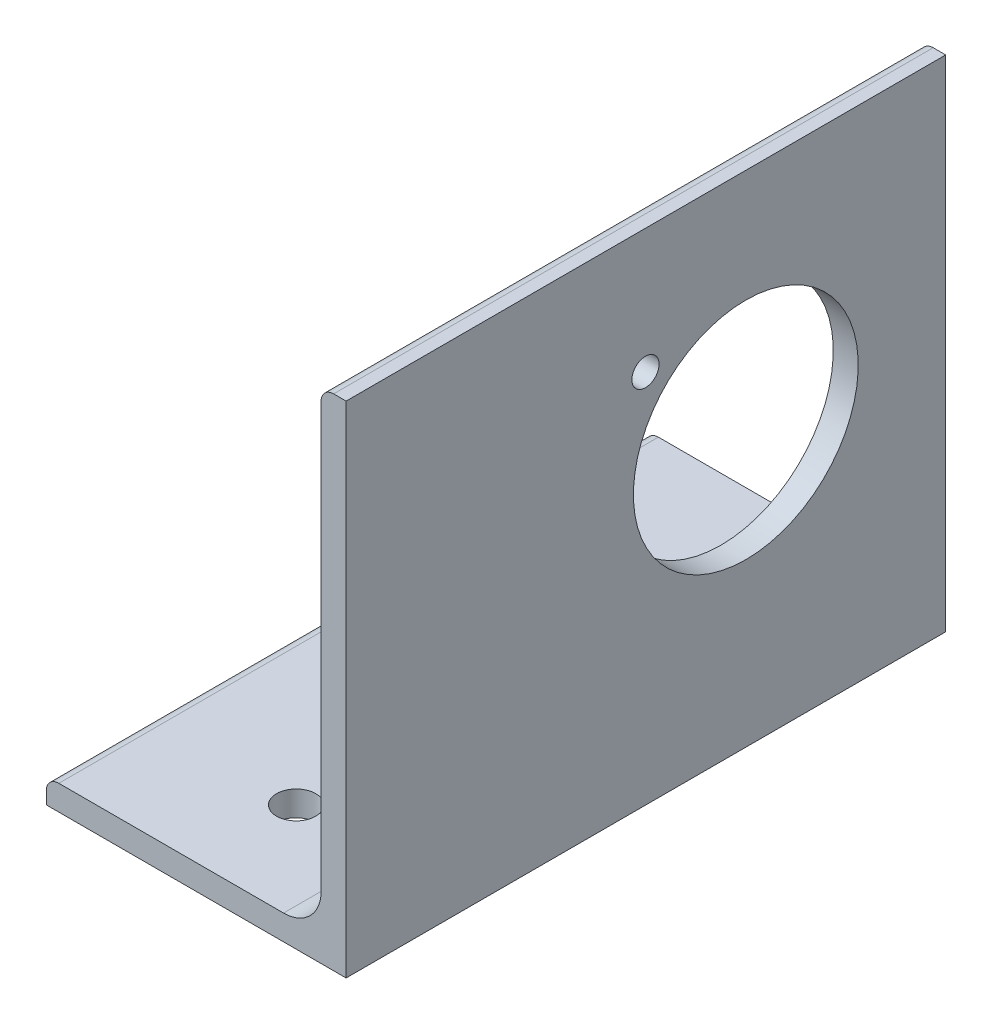
ISO-10303-21;
HEADER;
FILE_DESCRIPTION(('STEP AP214'),'2;1');
FILE_NAME('part.step','',(''),(''),'','','');
FILE_SCHEMA(('AUTOMOTIVE_DESIGN { 1 0 10303 214 1 1 1 1 }'));
ENDSEC;
DATA;
#1=APPLICATION_CONTEXT('core data for automotive mechanical design processes');
#2=APPLICATION_PROTOCOL_DEFINITION('international standard','automotive_design',2000,#1);
#3=PRODUCT_CONTEXT('',#1,'mechanical');
#4=PRODUCT('Part','Part','',(#3));
#5=PRODUCT_RELATED_PRODUCT_CATEGORY('part','',(#4));
#6=PRODUCT_DEFINITION_FORMATION('','',#4);
#7=PRODUCT_DEFINITION_CONTEXT('part definition',#1,'design');
#8=PRODUCT_DEFINITION('design','',#6,#7);
#9=PRODUCT_DEFINITION_SHAPE('','',#8);
#10=(LENGTH_UNIT() NAMED_UNIT(*) SI_UNIT(.MILLI.,.METRE.));
#11=(NAMED_UNIT(*) PLANE_ANGLE_UNIT() SI_UNIT($,.RADIAN.));
#12=(NAMED_UNIT(*) SI_UNIT($,.STERADIAN.) SOLID_ANGLE_UNIT());
#13=UNCERTAINTY_MEASURE_WITH_UNIT(LENGTH_MEASURE(1.E-05),#10,'distance_accuracy_value','');
#14=(GEOMETRIC_REPRESENTATION_CONTEXT(3) GLOBAL_UNCERTAINTY_ASSIGNED_CONTEXT((#13)) GLOBAL_UNIT_ASSIGNED_CONTEXT((#10,
#11,#12)) REPRESENTATION_CONTEXT('',''));
#15=CARTESIAN_POINT('',(0.,0.,0.));
#16=DIRECTION('',(0.,0.,1.));
#17=DIRECTION('',(1.,0.,0.));
#18=AXIS2_PLACEMENT_3D('',#15,#16,#17);
#19=CARTESIAN_POINT('',(-19.05,-30.1625,38.1));
#20=DIRECTION('',(1.,0.,0.));
#21=DIRECTION('',(0.,0.,-1.));
#22=AXIS2_PLACEMENT_3D('',#19,#20,#21);
#23=PLANE('',#22);
#24=DIRECTION('',(0.,-1.,0.));
#25=VECTOR('',#24,1.);
#26=CARTESIAN_POINT('',(-19.05,-30.1625,-38.1));
#27=LINE('',#26,#25);
#28=CARTESIAN_POINT('',(-19.05,-30.1625,-38.1));
#29=VERTEX_POINT('',#28);
#30=CARTESIAN_POINT('',(-19.05,-31.75,-38.1));
#31=VERTEX_POINT('',#30);
#32=EDGE_CURVE('E153',#29,#31,#27,.T.);
#33=ORIENTED_EDGE('',*,*,#32,.T.);
#34=DIRECTION('',(0.,0.,-1.));
#35=VECTOR('',#34,1.);
#36=CARTESIAN_POINT('',(-19.05,-31.75,38.1));
#37=LINE('',#36,#35);
#38=CARTESIAN_POINT('',(-19.05,-31.75,38.1));
#39=VERTEX_POINT('',#38);
#40=EDGE_CURVE('E11',#39,#31,#37,.T.);
#41=ORIENTED_EDGE('',*,*,#40,.F.);
#42=DIRECTION('',(0.,-1.,0.));
#43=VECTOR('',#42,1.);
#44=CARTESIAN_POINT('',(-19.05,-30.1625,38.1));
#45=LINE('',#44,#43);
#46=CARTESIAN_POINT('',(-19.05,-30.1625,38.1));
#47=VERTEX_POINT('',#46);
#48=EDGE_CURVE('E179',#47,#39,#45,.T.);
#49=ORIENTED_EDGE('',*,*,#48,.F.);
#50=DIRECTION('',(0.,0.,-1.));
#51=VECTOR('',#50,1.);
#52=CARTESIAN_POINT('',(-19.05,-30.1625,38.1));
#53=LINE('',#52,#51);
#54=EDGE_CURVE('E149',#47,#29,#53,.T.);
#55=ORIENTED_EDGE('',*,*,#54,.T.);
#56=EDGE_LOOP('',(#33,#41,#49,#55));
#57=FACE_BOUND('',#56,.T.);
#58=ADVANCED_FACE('F44',(#57),#23,.F.);
#59=CARTESIAN_POINT('',(-19.05,-31.75,38.1));
#60=DIRECTION('',(0.,1.,0.));
#61=DIRECTION('',(-1.,0.,0.));
#62=AXIS2_PLACEMENT_3D('',#59,#60,#61);
#63=PLANE('',#62);
#64=CARTESIAN_POINT('',(0.,-31.75,25.4));
#65=DIRECTION('',(0.,-1.,0.));
#66=DIRECTION('',(1.,0.,0.));
#67=AXIS2_PLACEMENT_3D('',#64,#65,#66);
#68=CIRCLE('',#67,2.4892);
#69=CARTESIAN_POINT('',(2.4892,-31.75,25.4));
#70=VERTEX_POINT('',#69);
#71=EDGE_CURVE('E203',#70,#70,#68,.T.);
#72=ORIENTED_EDGE('',*,*,#71,.F.);
#73=EDGE_LOOP('',(#72));
#74=FACE_BOUND('',#73,.T.);
#75=CARTESIAN_POINT('',(0.,-31.75,0.));
#76=DIRECTION('',(0.,-1.,0.));
#77=DIRECTION('',(1.,0.,0.));
#78=AXIS2_PLACEMENT_3D('',#75,#76,#77);
#79=CIRCLE('',#78,2.4892);
#80=CARTESIAN_POINT('',(2.4892,-31.75,0.));
#81=VERTEX_POINT('',#80);
#82=EDGE_CURVE('E211',#81,#81,#79,.T.);
#83=ORIENTED_EDGE('',*,*,#82,.F.);
#84=EDGE_LOOP('',(#83));
#85=FACE_BOUND('',#84,.T.);
#86=DIRECTION('',(1.,0.,0.));
#87=VECTOR('',#86,1.);
#88=CARTESIAN_POINT('',(-19.05,-31.75,-38.1));
#89=LINE('',#88,#87);
#90=CARTESIAN_POINT('',(19.05,-31.75,-38.1));
#91=VERTEX_POINT('',#90);
#92=EDGE_CURVE('E157',#31,#91,#89,.T.);
#93=ORIENTED_EDGE('',*,*,#92,.T.);
#94=DIRECTION('',(0.,0.,-1.));
#95=VECTOR('',#94,1.);
#96=CARTESIAN_POINT('',(19.05,-31.75,38.1));
#97=LINE('',#96,#95);
#98=CARTESIAN_POINT('',(19.05,-31.75,38.1));
#99=VERTEX_POINT('',#98);
#100=EDGE_CURVE('E54',#99,#91,#97,.T.);
#101=ORIENTED_EDGE('',*,*,#100,.F.);
#102=DIRECTION('',(1.,0.,0.));
#103=VECTOR('',#102,1.);
#104=CARTESIAN_POINT('',(-19.05,-31.75,38.1));
#105=LINE('',#104,#103);
#106=EDGE_CURVE('E109',#39,#99,#105,.T.);
#107=ORIENTED_EDGE('',*,*,#106,.F.);
#108=ORIENTED_EDGE('',*,*,#40,.T.);
#109=EDGE_LOOP('',(#93,#101,#107,#108));
#110=FACE_BOUND('',#109,.T.);
#111=ADVANCED_FACE('F275',(#74,#85,#110),#63,.F.);
#112=CARTESIAN_POINT('',(19.05,-31.75,38.1));
#113=DIRECTION('',(-1.,0.,0.));
#114=DIRECTION('',(0.,-1.,0.));
#115=AXIS2_PLACEMENT_3D('',#112,#113,#114);
#116=PLANE('',#115);
#117=CARTESIAN_POINT('',(19.05,15.9301386919437,0.0519634934806994));
#118=DIRECTION('',(-1.,0.,0.));
#119=DIRECTION('',(0.,-1.,0.));
#120=AXIS2_PLACEMENT_3D('',#117,#118,#119);
#121=CIRCLE('',#120,1.7272);
#122=CARTESIAN_POINT('',(19.05,14.2029386919437,0.0519634934806994));
#123=VERTEX_POINT('',#122);
#124=EDGE_CURVE('E209',#123,#123,#121,.T.);
#125=ORIENTED_EDGE('',*,*,#124,.T.);
#126=EDGE_LOOP('',(#125));
#127=FACE_BOUND('',#126,.T.);
#128=CARTESIAN_POINT('',(19.05,3.17817500002554,-12.7000001984375));
#129=DIRECTION('',(-1.,0.,0.));
#130=DIRECTION('',(0.,-1.,0.));
#131=AXIS2_PLACEMENT_3D('',#128,#129,#130);
#132=CIRCLE('',#131,14.2875);
#133=CARTESIAN_POINT('',(19.05,-11.1093249999745,-12.7000001984375));
#134=VERTEX_POINT('',#133);
#135=EDGE_CURVE('E158',#134,#134,#132,.T.);
#136=ORIENTED_EDGE('',*,*,#135,.T.);
#137=EDGE_LOOP('',(#136));
#138=FACE_BOUND('',#137,.T.);
#139=DIRECTION('',(0.,1.,0.));
#140=VECTOR('',#139,1.);
#141=CARTESIAN_POINT('',(19.05,-31.75,-38.1));
#142=LINE('',#141,#140);
#143=CARTESIAN_POINT('',(19.05,31.75,-38.1));
#144=VERTEX_POINT('',#143);
#145=EDGE_CURVE('E161',#91,#144,#142,.T.);
#146=ORIENTED_EDGE('',*,*,#145,.T.);
#147=DIRECTION('',(0.,0.,-1.));
#148=VECTOR('',#147,1.);
#149=CARTESIAN_POINT('',(19.05,31.75,38.1));
#150=LINE('',#149,#148);
#151=CARTESIAN_POINT('',(19.05,31.75,38.1));
#152=VERTEX_POINT('',#151);
#153=EDGE_CURVE('E194',#152,#144,#150,.T.);
#154=ORIENTED_EDGE('',*,*,#153,.F.);
#155=DIRECTION('',(0.,1.,0.));
#156=VECTOR('',#155,1.);
#157=CARTESIAN_POINT('',(19.05,-31.75,38.1));
#158=LINE('',#157,#156);
#159=EDGE_CURVE('E237',#99,#152,#158,.T.);
#160=ORIENTED_EDGE('',*,*,#159,.F.);
#161=ORIENTED_EDGE('',*,*,#100,.T.);
#162=EDGE_LOOP('',(#146,#154,#160,#161));
#163=FACE_BOUND('',#162,.T.);
#164=ADVANCED_FACE('F279',(#127,#138,#163),#116,.F.);
#165=CARTESIAN_POINT('',(17.4625,31.75,38.1));
#166=DIRECTION('',(0.,-1.,0.));
#167=DIRECTION('',(1.,0.,0.));
#168=AXIS2_PLACEMENT_3D('',#165,#166,#167);
#169=PLANE('',#168);
#170=DIRECTION('',(-1.,0.,0.));
#171=VECTOR('',#170,1.);
#172=CARTESIAN_POINT('',(17.4625,31.75,-38.1));
#173=LINE('',#172,#171);
#174=CARTESIAN_POINT('',(17.4625,31.75,-38.1));
#175=VERTEX_POINT('',#174);
#176=EDGE_CURVE('E164',#144,#175,#173,.T.);
#177=ORIENTED_EDGE('',*,*,#176,.T.);
#178=DIRECTION('',(0.,0.,-1.));
#179=VECTOR('',#178,1.);
#180=CARTESIAN_POINT('',(17.4625,31.75,38.1));
#181=LINE('',#180,#179);
#182=CARTESIAN_POINT('',(17.4625,31.75,38.1));
#183=VERTEX_POINT('',#182);
#184=EDGE_CURVE('E190',#183,#175,#181,.T.);
#185=ORIENTED_EDGE('',*,*,#184,.F.);
#186=DIRECTION('',(-1.,0.,0.));
#187=VECTOR('',#186,1.);
#188=CARTESIAN_POINT('',(17.4625,31.75,38.1));
#189=LINE('',#188,#187);
#190=EDGE_CURVE('E240',#152,#183,#189,.T.);
#191=ORIENTED_EDGE('',*,*,#190,.F.);
#192=ORIENTED_EDGE('',*,*,#153,.T.);
#193=EDGE_LOOP('',(#177,#185,#191,#192));
#194=FACE_BOUND('',#193,.T.);
#195=ADVANCED_FACE('F284',(#194),#169,.F.);
#196=CARTESIAN_POINT('',(17.4625,30.1625,38.1));
#197=DIRECTION('',(0.,0.,-1.));
#198=DIRECTION('',(-1.,0.,0.));
#199=AXIS2_PLACEMENT_3D('',#196,#197,#198);
#200=CYLINDRICAL_SURFACE('',#199,1.5875);
#201=CARTESIAN_POINT('',(17.4625,30.1625,-38.1));
#202=DIRECTION('',(0.,0.,1.));
#203=DIRECTION('',(-1.,0.,0.));
#204=AXIS2_PLACEMENT_3D('',#201,#202,#203);
#205=CIRCLE('',#204,1.5875);
#206=CARTESIAN_POINT('',(15.875,30.1625,-38.1));
#207=VERTEX_POINT('',#206);
#208=EDGE_CURVE('E167',#175,#207,#205,.T.);
#209=ORIENTED_EDGE('',*,*,#208,.T.);
#210=DIRECTION('',(0.,0.,-1.));
#211=VECTOR('',#210,1.);
#212=CARTESIAN_POINT('',(15.875,30.1625,38.1));
#213=LINE('',#212,#211);
#214=CARTESIAN_POINT('',(15.875,30.1625,38.1));
#215=VERTEX_POINT('',#214);
#216=EDGE_CURVE('E186',#215,#207,#213,.T.);
#217=ORIENTED_EDGE('',*,*,#216,.F.);
#218=CARTESIAN_POINT('',(17.4625,30.1625,38.1));
#219=DIRECTION('',(0.,0.,1.));
#220=DIRECTION('',(-1.,0.,0.));
#221=AXIS2_PLACEMENT_3D('',#218,#219,#220);
#222=CIRCLE('',#221,1.5875);
#223=EDGE_CURVE('E243',#183,#215,#222,.T.);
#224=ORIENTED_EDGE('',*,*,#223,.F.);
#225=ORIENTED_EDGE('',*,*,#184,.T.);
#226=EDGE_LOOP('',(#209,#217,#224,#225));
#227=FACE_BOUND('',#226,.T.);
#228=ADVANCED_FACE('F251',(#227),#200,.T.);
#229=CARTESIAN_POINT('',(15.875,30.1625,38.1));
#230=DIRECTION('',(1.,0.,0.));
#231=DIRECTION('',(0.,1.,0.));
#232=AXIS2_PLACEMENT_3D('',#229,#230,#231);
#233=PLANE('',#232);
#234=CARTESIAN_POINT('',(15.875,15.9301386919437,0.0519634934806994));
#235=DIRECTION('',(-1.,0.,0.));
#236=DIRECTION('',(0.,-1.,0.));
#237=AXIS2_PLACEMENT_3D('',#234,#235,#236);
#238=CIRCLE('',#237,1.7272);
#239=CARTESIAN_POINT('',(15.875,14.2029386919437,0.0519634934806994));
#240=VERTEX_POINT('',#239);
#241=EDGE_CURVE('E219',#240,#240,#238,.T.);
#242=ORIENTED_EDGE('',*,*,#241,.F.);
#243=EDGE_LOOP('',(#242));
#244=FACE_BOUND('',#243,.T.);
#245=CARTESIAN_POINT('',(15.875,3.17817500002554,-12.7000001984375));
#246=DIRECTION('',(-1.,0.,0.));
#247=DIRECTION('',(0.,-1.,0.));
#248=AXIS2_PLACEMENT_3D('',#245,#246,#247);
#249=CIRCLE('',#248,14.2875);
#250=CARTESIAN_POINT('',(15.875,-11.1093249999745,-12.7000001984375));
#251=VERTEX_POINT('',#250);
#252=EDGE_CURVE('E223',#251,#251,#249,.T.);
#253=ORIENTED_EDGE('',*,*,#252,.F.);
#254=EDGE_LOOP('',(#253));
#255=FACE_BOUND('',#254,.T.);
#256=DIRECTION('',(0.,-1.,0.));
#257=VECTOR('',#256,1.);
#258=CARTESIAN_POINT('',(15.875,30.1625,-38.1));
#259=LINE('',#258,#257);
#260=CARTESIAN_POINT('',(15.875,-23.7998,-38.1));
#261=VERTEX_POINT('',#260);
#262=EDGE_CURVE('E170',#207,#261,#259,.T.);
#263=ORIENTED_EDGE('',*,*,#262,.T.);
#264=DIRECTION('',(0.,0.,-1.));
#265=VECTOR('',#264,1.);
#266=CARTESIAN_POINT('',(15.875,-23.7998,38.1));
#267=LINE('',#266,#265);
#268=CARTESIAN_POINT('',(15.875,-23.7998,38.1));
#269=VERTEX_POINT('',#268);
#270=EDGE_CURVE('E142',#269,#261,#267,.T.);
#271=ORIENTED_EDGE('',*,*,#270,.F.);
#272=DIRECTION('',(0.,-1.,0.));
#273=VECTOR('',#272,1.);
#274=CARTESIAN_POINT('',(15.875,30.1625,38.1));
#275=LINE('',#274,#273);
#276=EDGE_CURVE('E131',#215,#269,#275,.T.);
#277=ORIENTED_EDGE('',*,*,#276,.F.);
#278=ORIENTED_EDGE('',*,*,#216,.T.);
#279=EDGE_LOOP('',(#263,#271,#277,#278));
#280=FACE_BOUND('',#279,.T.);
#281=ADVANCED_FACE('F255',(#244,#255,#280),#233,.F.);
#282=CARTESIAN_POINT('',(11.0998,-23.7998,38.1));
#283=DIRECTION('',(0.,0.,-1.));
#284=DIRECTION('',(-1.,0.,0.));
#285=AXIS2_PLACEMENT_3D('',#282,#283,#284);
#286=CYLINDRICAL_SURFACE('',#285,4.7752);
#287=CARTESIAN_POINT('',(11.0998,-23.7998,-38.1));
#288=DIRECTION('',(0.,0.,-1.));
#289=DIRECTION('',(-1.,0.,0.));
#290=AXIS2_PLACEMENT_3D('',#287,#288,#289);
#291=CIRCLE('',#290,4.7752);
#292=CARTESIAN_POINT('',(11.0998,-28.575,-38.1));
#293=VERTEX_POINT('',#292);
#294=EDGE_CURVE('E140',#261,#293,#291,.T.);
#295=ORIENTED_EDGE('',*,*,#294,.T.);
#296=DIRECTION('',(0.,0.,-1.));
#297=VECTOR('',#296,1.);
#298=CARTESIAN_POINT('',(11.0998,-28.575,38.1));
#299=LINE('',#298,#297);
#300=CARTESIAN_POINT('',(11.0998,-28.575,38.1));
#301=VERTEX_POINT('',#300);
#302=EDGE_CURVE('E137',#301,#293,#299,.T.);
#303=ORIENTED_EDGE('',*,*,#302,.F.);
#304=CARTESIAN_POINT('',(11.0998,-23.7998,38.1));
#305=DIRECTION('',(0.,0.,-1.));
#306=DIRECTION('',(-1.,0.,0.));
#307=AXIS2_PLACEMENT_3D('',#304,#305,#306);
#308=CIRCLE('',#307,4.7752);
#309=EDGE_CURVE('E125',#269,#301,#308,.T.);
#310=ORIENTED_EDGE('',*,*,#309,.F.);
#311=ORIENTED_EDGE('',*,*,#270,.T.);
#312=EDGE_LOOP('',(#295,#303,#310,#311));
#313=FACE_BOUND('',#312,.T.);
#314=ADVANCED_FACE('F138',(#313),#286,.F.);
#315=CARTESIAN_POINT('',(11.0998,-28.575,38.1));
#316=DIRECTION('',(0.,-1.,0.));
#317=DIRECTION('',(1.,0.,0.));
#318=AXIS2_PLACEMENT_3D('',#315,#316,#317);
#319=PLANE('',#318);
#320=CARTESIAN_POINT('',(0.,-28.575,25.4));
#321=DIRECTION('',(0.,-1.,0.));
#322=DIRECTION('',(1.,0.,0.));
#323=AXIS2_PLACEMENT_3D('',#320,#321,#322);
#324=CIRCLE('',#323,2.4892);
#325=CARTESIAN_POINT('',(2.4892,-28.575,25.4));
#326=VERTEX_POINT('',#325);
#327=EDGE_CURVE('E47',#326,#326,#324,.T.);
#328=ORIENTED_EDGE('',*,*,#327,.T.);
#329=EDGE_LOOP('',(#328));
#330=FACE_BOUND('',#329,.T.);
#331=CARTESIAN_POINT('',(0.,-28.575,0.));
#332=DIRECTION('',(0.,-1.,0.));
#333=DIRECTION('',(1.,0.,0.));
#334=AXIS2_PLACEMENT_3D('',#331,#332,#333);
#335=CIRCLE('',#334,2.4892);
#336=CARTESIAN_POINT('',(2.4892,-28.575,0.));
#337=VERTEX_POINT('',#336);
#338=EDGE_CURVE('E200',#337,#337,#335,.T.);
#339=ORIENTED_EDGE('',*,*,#338,.T.);
#340=EDGE_LOOP('',(#339));
#341=FACE_BOUND('',#340,.T.);
#342=DIRECTION('',(-1.,0.,0.));
#343=VECTOR('',#342,1.);
#344=CARTESIAN_POINT('',(11.0998,-28.575,-38.1));
#345=LINE('',#344,#343);
#346=CARTESIAN_POINT('',(-17.4625,-28.575,-38.1));
#347=VERTEX_POINT('',#346);
#348=EDGE_CURVE('E95',#293,#347,#345,.T.);
#349=ORIENTED_EDGE('',*,*,#348,.T.);
#350=DIRECTION('',(0.,0.,-1.));
#351=VECTOR('',#350,1.);
#352=CARTESIAN_POINT('',(-17.4625,-28.575,38.1));
#353=LINE('',#352,#351);
#354=CARTESIAN_POINT('',(-17.4625,-28.575,38.1));
#355=VERTEX_POINT('',#354);
#356=EDGE_CURVE('E143',#355,#347,#353,.T.);
#357=ORIENTED_EDGE('',*,*,#356,.F.);
#358=DIRECTION('',(-1.,0.,0.));
#359=VECTOR('',#358,1.);
#360=CARTESIAN_POINT('',(11.0998,-28.575,38.1));
#361=LINE('',#360,#359);
#362=EDGE_CURVE('E129',#301,#355,#361,.T.);
#363=ORIENTED_EDGE('',*,*,#362,.F.);
#364=ORIENTED_EDGE('',*,*,#302,.T.);
#365=EDGE_LOOP('',(#349,#357,#363,#364));
#366=FACE_BOUND('',#365,.T.);
#367=ADVANCED_FACE('F145',(#330,#341,#366),#319,.F.);
#368=CARTESIAN_POINT('',(-17.4625,-30.1625,38.1));
#369=DIRECTION('',(0.,0.,-1.));
#370=DIRECTION('',(-1.,0.,0.));
#371=AXIS2_PLACEMENT_3D('',#368,#369,#370);
#372=CYLINDRICAL_SURFACE('',#371,1.5875);
#373=CARTESIAN_POINT('',(-17.4625,-30.1625,-38.1));
#374=DIRECTION('',(0.,0.,1.));
#375=DIRECTION('',(-1.,0.,0.));
#376=AXIS2_PLACEMENT_3D('',#373,#374,#375);
#377=CIRCLE('',#376,1.5875);
#378=EDGE_CURVE('E101',#347,#29,#377,.T.);
#379=ORIENTED_EDGE('',*,*,#378,.T.);
#380=ORIENTED_EDGE('',*,*,#54,.F.);
#381=CARTESIAN_POINT('',(-17.4625,-30.1625,38.1));
#382=DIRECTION('',(0.,0.,1.));
#383=DIRECTION('',(-1.,0.,0.));
#384=AXIS2_PLACEMENT_3D('',#381,#382,#383);
#385=CIRCLE('',#384,1.5875);
#386=EDGE_CURVE('E63',#355,#47,#385,.T.);
#387=ORIENTED_EDGE('',*,*,#386,.F.);
#388=ORIENTED_EDGE('',*,*,#356,.T.);
#389=EDGE_LOOP('',(#379,#380,#387,#388));
#390=FACE_BOUND('',#389,.T.);
#391=ADVANCED_FACE('F263',(#390),#372,.T.);
#392=CARTESIAN_POINT('',(17.4625,30.1625,38.1));
#393=DIRECTION('',(0.,0.,-1.));
#394=DIRECTION('',(-1.,0.,0.));
#395=AXIS2_PLACEMENT_3D('',#392,#393,#394);
#396=PLANE('',#395);
#397=ORIENTED_EDGE('',*,*,#48,.T.);
#398=ORIENTED_EDGE('',*,*,#106,.T.);
#399=ORIENTED_EDGE('',*,*,#159,.T.);
#400=ORIENTED_EDGE('',*,*,#190,.T.);
#401=ORIENTED_EDGE('',*,*,#223,.T.);
#402=ORIENTED_EDGE('',*,*,#276,.T.);
#403=ORIENTED_EDGE('',*,*,#309,.T.);
#404=ORIENTED_EDGE('',*,*,#362,.T.);
#405=ORIENTED_EDGE('',*,*,#386,.T.);
#406=EDGE_LOOP('',(#397,#398,#399,#400,#401,#402,#403,#404,#405));
#407=FACE_BOUND('',#406,.T.);
#408=ADVANCED_FACE('F127',(#407),#396,.F.);
#409=CARTESIAN_POINT('',(17.4625,30.1625,-38.1));
#410=DIRECTION('',(0.,0.,-1.));
#411=DIRECTION('',(-1.,0.,0.));
#412=AXIS2_PLACEMENT_3D('',#409,#410,#411);
#413=PLANE('',#412);
#414=ORIENTED_EDGE('',*,*,#32,.F.);
#415=ORIENTED_EDGE('',*,*,#378,.F.);
#416=ORIENTED_EDGE('',*,*,#348,.F.);
#417=ORIENTED_EDGE('',*,*,#294,.F.);
#418=ORIENTED_EDGE('',*,*,#262,.F.);
#419=ORIENTED_EDGE('',*,*,#208,.F.);
#420=ORIENTED_EDGE('',*,*,#176,.F.);
#421=ORIENTED_EDGE('',*,*,#145,.F.);
#422=ORIENTED_EDGE('',*,*,#92,.F.);
#423=EDGE_LOOP('',(#414,#415,#416,#417,#418,#419,#420,#421,#422));
#424=FACE_BOUND('',#423,.T.);
#425=ADVANCED_FACE('F258',(#424),#413,.T.);
#426=CARTESIAN_POINT('',(19.05,3.17817500002554,-12.7000001984375));
#427=DIRECTION('',(-1.,0.,0.));
#428=DIRECTION('',(0.,-1.,0.));
#429=AXIS2_PLACEMENT_3D('',#426,#427,#428);
#430=CYLINDRICAL_SURFACE('',#429,14.2875);
#431=ORIENTED_EDGE('',*,*,#135,.F.);
#432=EDGE_LOOP('',(#431));
#433=FACE_BOUND('',#432,.T.);
#434=ORIENTED_EDGE('',*,*,#252,.T.);
#435=EDGE_LOOP('',(#434));
#436=FACE_BOUND('',#435,.T.);
#437=ADVANCED_FACE('F345',(#433,#436),#430,.F.);
#438=CARTESIAN_POINT('',(19.05,15.9301386919437,0.0519634934806994));
#439=DIRECTION('',(-1.,0.,0.));
#440=DIRECTION('',(0.,-1.,0.));
#441=AXIS2_PLACEMENT_3D('',#438,#439,#440);
#442=CYLINDRICAL_SURFACE('',#441,1.7272);
#443=ORIENTED_EDGE('',*,*,#124,.F.);
#444=EDGE_LOOP('',(#443));
#445=FACE_BOUND('',#444,.T.);
#446=ORIENTED_EDGE('',*,*,#241,.T.);
#447=EDGE_LOOP('',(#446));
#448=FACE_BOUND('',#447,.T.);
#449=ADVANCED_FACE('F323',(#445,#448),#442,.F.);
#450=CARTESIAN_POINT('',(0.,31.75,0.));
#451=DIRECTION('',(0.,-1.,0.));
#452=DIRECTION('',(1.,0.,0.));
#453=AXIS2_PLACEMENT_3D('',#450,#451,#452);
#454=CYLINDRICAL_SURFACE('',#453,2.4892);
#455=ORIENTED_EDGE('',*,*,#82,.T.);
#456=EDGE_LOOP('',(#455));
#457=FACE_BOUND('',#456,.T.);
#458=ORIENTED_EDGE('',*,*,#338,.F.);
#459=EDGE_LOOP('',(#458));
#460=FACE_BOUND('',#459,.T.);
#461=ADVANCED_FACE('F317',(#457,#460),#454,.F.);
#462=CARTESIAN_POINT('',(0.,31.75,25.4));
#463=DIRECTION('',(0.,-1.,0.));
#464=DIRECTION('',(1.,0.,0.));
#465=AXIS2_PLACEMENT_3D('',#462,#463,#464);
#466=CYLINDRICAL_SURFACE('',#465,2.4892);
#467=ORIENTED_EDGE('',*,*,#71,.T.);
#468=EDGE_LOOP('',(#467));
#469=FACE_BOUND('',#468,.T.);
#470=ORIENTED_EDGE('',*,*,#327,.F.);
#471=EDGE_LOOP('',(#470));
#472=FACE_BOUND('',#471,.T.);
#473=ADVANCED_FACE('F322',(#469,#472),#466,.F.);
#474=CLOSED_SHELL('',(#58,#111,#164,#195,#228,#281,#314,#367,#391,#408,#425,#437,#449,#461,#473));
#475=MANIFOLD_SOLID_BREP('B2',#474);
#476=ADVANCED_BREP_SHAPE_REPRESENTATION('',(#18,#475),#14);
#477=SHAPE_DEFINITION_REPRESENTATION(#9,#476);
ENDSEC;
END-ISO-10303-21;
